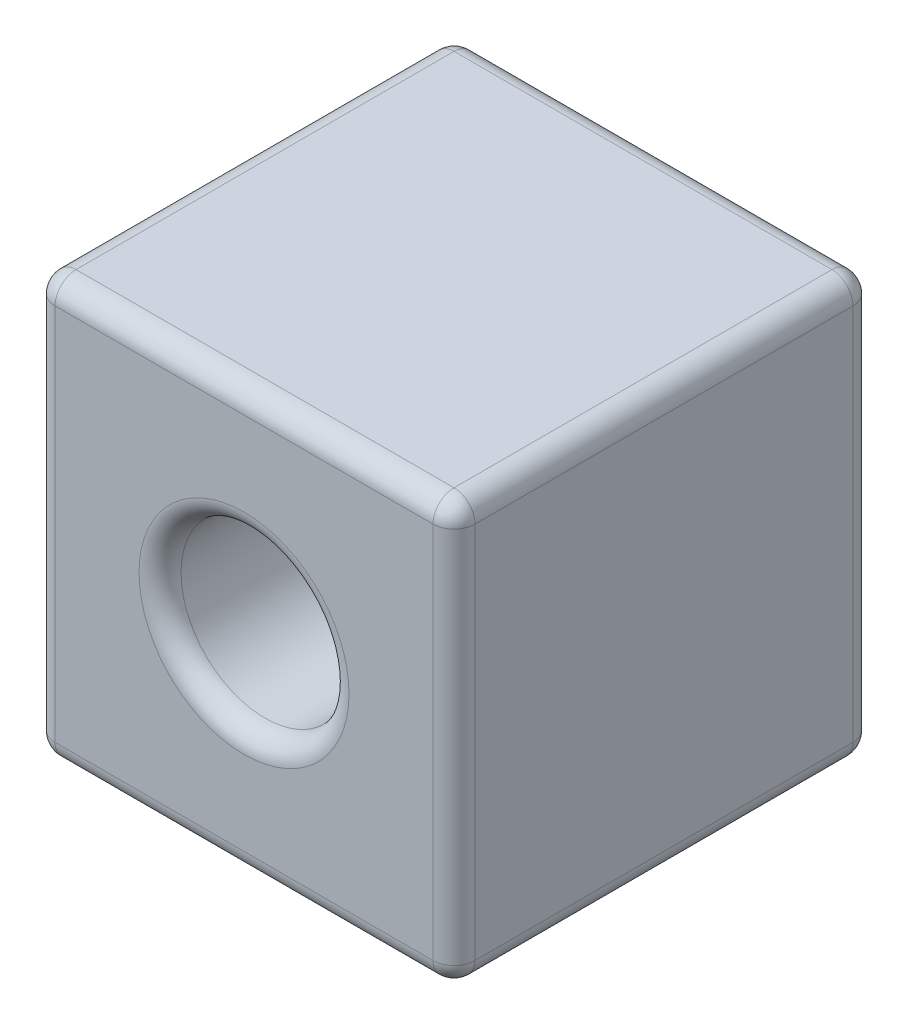
ISO-10303-21;
HEADER;
FILE_DESCRIPTION(('STEP AP214'),'2;1');
FILE_NAME('part.step','',(''),(''),'','','');
FILE_SCHEMA(('AUTOMOTIVE_DESIGN { 1 0 10303 214 1 1 1 1 }'));
ENDSEC;
DATA;
#1=APPLICATION_CONTEXT('core data for automotive mechanical design processes');
#2=APPLICATION_PROTOCOL_DEFINITION('international standard','automotive_design',2000,#1);
#3=PRODUCT_CONTEXT('',#1,'mechanical');
#4=PRODUCT('Part','Part','',(#3));
#5=PRODUCT_RELATED_PRODUCT_CATEGORY('part','',(#4));
#6=PRODUCT_DEFINITION_FORMATION('','',#4);
#7=PRODUCT_DEFINITION_CONTEXT('part definition',#1,'design');
#8=PRODUCT_DEFINITION('design','',#6,#7);
#9=PRODUCT_DEFINITION_SHAPE('','',#8);
#10=(LENGTH_UNIT() NAMED_UNIT(*) SI_UNIT(.MILLI.,.METRE.));
#11=(NAMED_UNIT(*) PLANE_ANGLE_UNIT() SI_UNIT($,.RADIAN.));
#12=(NAMED_UNIT(*) SI_UNIT($,.STERADIAN.) SOLID_ANGLE_UNIT());
#13=UNCERTAINTY_MEASURE_WITH_UNIT(LENGTH_MEASURE(1.E-05),#10,'distance_accuracy_value','');
#14=(GEOMETRIC_REPRESENTATION_CONTEXT(3) GLOBAL_UNCERTAINTY_ASSIGNED_CONTEXT((#13)) GLOBAL_UNIT_ASSIGNED_CONTEXT((#10,
#11,#12)) REPRESENTATION_CONTEXT('',''));
#15=CARTESIAN_POINT('',(0.,0.,0.));
#16=DIRECTION('',(0.,0.,1.));
#17=DIRECTION('',(1.,0.,0.));
#18=AXIS2_PLACEMENT_3D('',#15,#16,#17);
#19=CARTESIAN_POINT('',(0.,0.,100.));
#20=DIRECTION('',(0.,0.,1.));
#21=DIRECTION('',(1.,0.,0.));
#22=AXIS2_PLACEMENT_3D('',#19,#20,#21);
#23=PLANE('',#22);
#24=CARTESIAN_POINT('',(0.,0.,100.));
#25=DIRECTION('',(0.,0.,1.));
#26=DIRECTION('',(1.,0.,0.));
#27=AXIS2_PLACEMENT_3D('',#24,#25,#26);
#28=CIRCLE('',#27,25.);
#29=CARTESIAN_POINT('',(25.,0.,100.));
#30=VERTEX_POINT('',#29);
#31=EDGE_CURVE('E11',#30,#30,#28,.F.);
#32=ORIENTED_EDGE('',*,*,#31,.T.);
#33=EDGE_LOOP('',(#32));
#34=FACE_BOUND('',#33,.T.);
#35=DIRECTION('',(-1.,0.,0.));
#36=VECTOR('',#35,1.);
#37=CARTESIAN_POINT('',(-50.,45.,100.));
#38=LINE('',#37,#36);
#39=CARTESIAN_POINT('',(45.,45.,100.));
#40=VERTEX_POINT('',#39);
#41=CARTESIAN_POINT('',(-45.,45.,100.));
#42=VERTEX_POINT('',#41);
#43=EDGE_CURVE('E141',#40,#42,#38,.T.);
#44=ORIENTED_EDGE('',*,*,#43,.T.);
#45=DIRECTION('',(0.,-1.,0.));
#46=VECTOR('',#45,1.);
#47=CARTESIAN_POINT('',(-45.,-50.,100.));
#48=LINE('',#47,#46);
#49=CARTESIAN_POINT('',(-45.,-45.,100.));
#50=VERTEX_POINT('',#49);
#51=EDGE_CURVE('E200',#42,#50,#48,.T.);
#52=ORIENTED_EDGE('',*,*,#51,.T.);
#53=DIRECTION('',(1.,0.,0.));
#54=VECTOR('',#53,1.);
#55=CARTESIAN_POINT('',(50.,-45.,100.));
#56=LINE('',#55,#54);
#57=CARTESIAN_POINT('',(45.,-45.,100.));
#58=VERTEX_POINT('',#57);
#59=EDGE_CURVE('E195',#50,#58,#56,.T.);
#60=ORIENTED_EDGE('',*,*,#59,.T.);
#61=DIRECTION('',(0.,1.,0.));
#62=VECTOR('',#61,1.);
#63=CARTESIAN_POINT('',(45.,50.,100.));
#64=LINE('',#63,#62);
#65=EDGE_CURVE('E197',#58,#40,#64,.T.);
#66=ORIENTED_EDGE('',*,*,#65,.T.);
#67=EDGE_LOOP('',(#44,#52,#60,#66));
#68=FACE_BOUND('',#67,.T.);
#69=ADVANCED_FACE('F35',(#34,#68),#23,.T.);
#70=CARTESIAN_POINT('',(0.,0.,0.));
#71=DIRECTION('',(0.,0.,1.));
#72=DIRECTION('',(1.,0.,0.));
#73=AXIS2_PLACEMENT_3D('',#70,#71,#72);
#74=PLANE('',#73);
#75=CARTESIAN_POINT('',(0.,0.,0.));
#76=DIRECTION('',(0.,0.,1.));
#77=DIRECTION('',(1.,0.,0.));
#78=AXIS2_PLACEMENT_3D('',#75,#76,#77);
#79=CIRCLE('',#78,25.);
#80=CARTESIAN_POINT('',(25.,0.,0.));
#81=VERTEX_POINT('',#80);
#82=EDGE_CURVE('E209',#81,#81,#79,.T.);
#83=ORIENTED_EDGE('',*,*,#82,.T.);
#84=EDGE_LOOP('',(#83));
#85=FACE_BOUND('',#84,.T.);
#86=DIRECTION('',(0.,-1.,0.));
#87=VECTOR('',#86,1.);
#88=CARTESIAN_POINT('',(-45.,0.,0.));
#89=LINE('',#88,#87);
#90=CARTESIAN_POINT('',(-45.,-45.,0.));
#91=VERTEX_POINT('',#90);
#92=CARTESIAN_POINT('',(-45.,45.,0.));
#93=VERTEX_POINT('',#92);
#94=EDGE_CURVE('E172',#91,#93,#89,.F.);
#95=ORIENTED_EDGE('',*,*,#94,.T.);
#96=DIRECTION('',(-1.,0.,0.));
#97=VECTOR('',#96,1.);
#98=CARTESIAN_POINT('',(0.,45.,0.));
#99=LINE('',#98,#97);
#100=CARTESIAN_POINT('',(45.,45.,0.));
#101=VERTEX_POINT('',#100);
#102=EDGE_CURVE('E174',#93,#101,#99,.F.);
#103=ORIENTED_EDGE('',*,*,#102,.T.);
#104=DIRECTION('',(0.,1.,0.));
#105=VECTOR('',#104,1.);
#106=CARTESIAN_POINT('',(45.,0.,0.));
#107=LINE('',#106,#105);
#108=CARTESIAN_POINT('',(45.,-45.,0.));
#109=VERTEX_POINT('',#108);
#110=EDGE_CURVE('E168',#101,#109,#107,.F.);
#111=ORIENTED_EDGE('',*,*,#110,.T.);
#112=DIRECTION('',(1.,0.,0.));
#113=VECTOR('',#112,1.);
#114=CARTESIAN_POINT('',(0.,-45.,0.));
#115=LINE('',#114,#113);
#116=EDGE_CURVE('E170',#109,#91,#115,.F.);
#117=ORIENTED_EDGE('',*,*,#116,.T.);
#118=EDGE_LOOP('',(#95,#103,#111,#117));
#119=FACE_BOUND('',#118,.T.);
#120=ADVANCED_FACE('F275',(#85,#119),#74,.F.);
#121=CARTESIAN_POINT('',(50.,50.,100.));
#122=DIRECTION('',(-1.,0.,0.));
#123=DIRECTION('',(0.,-1.,0.));
#124=AXIS2_PLACEMENT_3D('',#121,#122,#123);
#125=PLANE('',#124);
#126=DIRECTION('',(0.,1.,0.));
#127=VECTOR('',#126,1.);
#128=CARTESIAN_POINT('',(50.,50.,5.));
#129=LINE('',#128,#127);
#130=CARTESIAN_POINT('',(50.,-45.,5.));
#131=VERTEX_POINT('',#130);
#132=CARTESIAN_POINT('',(50.,45.,5.));
#133=VERTEX_POINT('',#132);
#134=EDGE_CURVE('E50',#131,#133,#129,.T.);
#135=ORIENTED_EDGE('',*,*,#134,.T.);
#136=DIRECTION('',(0.,0.,-1.));
#137=VECTOR('',#136,1.);
#138=CARTESIAN_POINT('',(50.,45.,100.));
#139=LINE('',#138,#137);
#140=CARTESIAN_POINT('',(50.,45.,95.));
#141=VERTEX_POINT('',#140);
#142=EDGE_CURVE('E207',#133,#141,#139,.F.);
#143=ORIENTED_EDGE('',*,*,#142,.T.);
#144=DIRECTION('',(0.,1.,0.));
#145=VECTOR('',#144,1.);
#146=CARTESIAN_POINT('',(50.,-50.,95.));
#147=LINE('',#146,#145);
#148=CARTESIAN_POINT('',(50.,-45.,95.));
#149=VERTEX_POINT('',#148);
#150=EDGE_CURVE('E203',#141,#149,#147,.F.);
#151=ORIENTED_EDGE('',*,*,#150,.T.);
#152=DIRECTION('',(0.,0.,-1.));
#153=VECTOR('',#152,1.);
#154=CARTESIAN_POINT('',(50.,-45.,100.));
#155=LINE('',#154,#153);
#156=EDGE_CURVE('E55',#149,#131,#155,.T.);
#157=ORIENTED_EDGE('',*,*,#156,.T.);
#158=EDGE_LOOP('',(#135,#143,#151,#157));
#159=FACE_BOUND('',#158,.T.);
#160=ADVANCED_FACE('F278',(#159),#125,.F.);
#161=CARTESIAN_POINT('',(-50.,50.,100.));
#162=DIRECTION('',(0.,-1.,0.));
#163=DIRECTION('',(0.,0.,-1.));
#164=AXIS2_PLACEMENT_3D('',#161,#162,#163);
#165=PLANE('',#164);
#166=DIRECTION('',(0.,0.,-1.));
#167=VECTOR('',#166,1.);
#168=CARTESIAN_POINT('',(45.,50.,100.));
#169=LINE('',#168,#167);
#170=CARTESIAN_POINT('',(45.,50.,95.));
#171=VERTEX_POINT('',#170);
#172=CARTESIAN_POINT('',(45.,50.,5.));
#173=VERTEX_POINT('',#172);
#174=EDGE_CURVE('E128',#171,#173,#169,.T.);
#175=ORIENTED_EDGE('',*,*,#174,.T.);
#176=DIRECTION('',(-1.,0.,0.));
#177=VECTOR('',#176,1.);
#178=CARTESIAN_POINT('',(-50.,50.,5.));
#179=LINE('',#178,#177);
#180=CARTESIAN_POINT('',(-45.,50.,5.));
#181=VERTEX_POINT('',#180);
#182=EDGE_CURVE('E166',#173,#181,#179,.T.);
#183=ORIENTED_EDGE('',*,*,#182,.T.);
#184=DIRECTION('',(0.,0.,-1.));
#185=VECTOR('',#184,1.);
#186=CARTESIAN_POINT('',(-45.,50.,100.));
#187=LINE('',#186,#185);
#188=CARTESIAN_POINT('',(-45.,50.,95.));
#189=VERTEX_POINT('',#188);
#190=EDGE_CURVE('E131',#181,#189,#187,.F.);
#191=ORIENTED_EDGE('',*,*,#190,.T.);
#192=DIRECTION('',(-1.,0.,0.));
#193=VECTOR('',#192,1.);
#194=CARTESIAN_POINT('',(50.,50.,95.));
#195=LINE('',#194,#193);
#196=EDGE_CURVE('E123',#189,#171,#195,.F.);
#197=ORIENTED_EDGE('',*,*,#196,.T.);
#198=EDGE_LOOP('',(#175,#183,#191,#197));
#199=FACE_BOUND('',#198,.T.);
#200=ADVANCED_FACE('F125',(#199),#165,.F.);
#201=CARTESIAN_POINT('',(-50.,50.,100.));
#202=DIRECTION('',(1.,0.,0.));
#203=DIRECTION('',(0.,1.,0.));
#204=AXIS2_PLACEMENT_3D('',#201,#202,#203);
#205=PLANE('',#204);
#206=DIRECTION('',(0.,-1.,0.));
#207=VECTOR('',#206,1.);
#208=CARTESIAN_POINT('',(-50.,50.,95.));
#209=LINE('',#208,#207);
#210=CARTESIAN_POINT('',(-50.,-45.,95.));
#211=VERTEX_POINT('',#210);
#212=CARTESIAN_POINT('',(-50.,45.,95.));
#213=VERTEX_POINT('',#212);
#214=EDGE_CURVE('E177',#211,#213,#209,.F.);
#215=ORIENTED_EDGE('',*,*,#214,.T.);
#216=DIRECTION('',(0.,0.,-1.));
#217=VECTOR('',#216,1.);
#218=CARTESIAN_POINT('',(-50.,45.,100.));
#219=LINE('',#218,#217);
#220=CARTESIAN_POINT('',(-50.,45.,5.));
#221=VERTEX_POINT('',#220);
#222=EDGE_CURVE('E183',#213,#221,#219,.T.);
#223=ORIENTED_EDGE('',*,*,#222,.T.);
#224=DIRECTION('',(0.,-1.,0.));
#225=VECTOR('',#224,1.);
#226=CARTESIAN_POINT('',(-50.,50.,5.));
#227=LINE('',#226,#225);
#228=CARTESIAN_POINT('',(-50.,-45.,5.));
#229=VERTEX_POINT('',#228);
#230=EDGE_CURVE('E181',#221,#229,#227,.T.);
#231=ORIENTED_EDGE('',*,*,#230,.T.);
#232=DIRECTION('',(0.,0.,-1.));
#233=VECTOR('',#232,1.);
#234=CARTESIAN_POINT('',(-50.,-45.,100.));
#235=LINE('',#234,#233);
#236=EDGE_CURVE('E179',#229,#211,#235,.F.);
#237=ORIENTED_EDGE('',*,*,#236,.T.);
#238=EDGE_LOOP('',(#215,#223,#231,#237));
#239=FACE_BOUND('',#238,.T.);
#240=ADVANCED_FACE('F338',(#239),#205,.F.);
#241=CARTESIAN_POINT('',(-50.,-50.,100.));
#242=DIRECTION('',(0.,1.,0.));
#243=DIRECTION('',(0.,0.,1.));
#244=AXIS2_PLACEMENT_3D('',#241,#242,#243);
#245=PLANE('',#244);
#246=DIRECTION('',(0.,0.,-1.));
#247=VECTOR('',#246,1.);
#248=CARTESIAN_POINT('',(-45.,-50.,100.));
#249=LINE('',#248,#247);
#250=CARTESIAN_POINT('',(-45.,-50.,95.));
#251=VERTEX_POINT('',#250);
#252=CARTESIAN_POINT('',(-45.,-50.,5.));
#253=VERTEX_POINT('',#252);
#254=EDGE_CURVE('E190',#251,#253,#249,.T.);
#255=ORIENTED_EDGE('',*,*,#254,.T.);
#256=DIRECTION('',(1.,0.,0.));
#257=VECTOR('',#256,1.);
#258=CARTESIAN_POINT('',(-50.,-50.,5.));
#259=LINE('',#258,#257);
#260=CARTESIAN_POINT('',(45.,-50.,5.));
#261=VERTEX_POINT('',#260);
#262=EDGE_CURVE('E192',#253,#261,#259,.T.);
#263=ORIENTED_EDGE('',*,*,#262,.T.);
#264=DIRECTION('',(0.,0.,-1.));
#265=VECTOR('',#264,1.);
#266=CARTESIAN_POINT('',(45.,-50.,100.));
#267=LINE('',#266,#265);
#268=CARTESIAN_POINT('',(45.,-50.,95.));
#269=VERTEX_POINT('',#268);
#270=EDGE_CURVE('E188',#261,#269,#267,.F.);
#271=ORIENTED_EDGE('',*,*,#270,.T.);
#272=DIRECTION('',(1.,0.,0.));
#273=VECTOR('',#272,1.);
#274=CARTESIAN_POINT('',(-50.,-50.,95.));
#275=LINE('',#274,#273);
#276=EDGE_CURVE('E186',#269,#251,#275,.F.);
#277=ORIENTED_EDGE('',*,*,#276,.T.);
#278=EDGE_LOOP('',(#255,#263,#271,#277));
#279=FACE_BOUND('',#278,.T.);
#280=ADVANCED_FACE('F335',(#279),#245,.F.);
#281=CARTESIAN_POINT('',(0.,0.,100.));
#282=DIRECTION('',(0.,0.,-1.));
#283=DIRECTION('',(-1.,0.,0.));
#284=AXIS2_PLACEMENT_3D('',#281,#282,#283);
#285=CYLINDRICAL_SURFACE('',#284,20.);
#286=CARTESIAN_POINT('',(0.,0.,5.));
#287=DIRECTION('',(0.,0.,1.));
#288=DIRECTION('',(1.,0.,0.));
#289=AXIS2_PLACEMENT_3D('',#286,#287,#288);
#290=CIRCLE('',#289,20.);
#291=CARTESIAN_POINT('',(20.,0.,5.));
#292=VERTEX_POINT('',#291);
#293=EDGE_CURVE('E43',#292,#292,#290,.F.);
#294=ORIENTED_EDGE('',*,*,#293,.T.);
#295=EDGE_LOOP('',(#294));
#296=FACE_BOUND('',#295,.T.);
#297=CARTESIAN_POINT('',(0.,0.,95.));
#298=DIRECTION('',(0.,0.,1.));
#299=DIRECTION('',(1.,0.,0.));
#300=AXIS2_PLACEMENT_3D('',#297,#298,#299);
#301=CIRCLE('',#300,20.);
#302=CARTESIAN_POINT('',(20.,0.,95.));
#303=VERTEX_POINT('',#302);
#304=EDGE_CURVE('E261',#303,#303,#301,.T.);
#305=ORIENTED_EDGE('',*,*,#304,.T.);
#306=EDGE_LOOP('',(#305));
#307=FACE_BOUND('',#306,.T.);
#308=ADVANCED_FACE('F266',(#296,#307),#285,.F.);
#309=CARTESIAN_POINT('',(0.,-45.,95.));
#310=DIRECTION('',(-1.,0.,0.));
#311=DIRECTION('',(0.,0.,1.));
#312=AXIS2_PLACEMENT_3D('',#309,#310,#311);
#313=CYLINDRICAL_SURFACE('',#312,5.);
#314=CARTESIAN_POINT('',(45.,-45.,95.));
#315=DIRECTION('',(1.,0.,0.));
#316=DIRECTION('',(0.,0.,-1.));
#317=AXIS2_PLACEMENT_3D('',#314,#315,#316);
#318=CIRCLE('',#317,5.);
#319=EDGE_CURVE('E159',#58,#269,#318,.T.);
#320=ORIENTED_EDGE('',*,*,#319,.F.);
#321=ORIENTED_EDGE('',*,*,#59,.F.);
#322=CARTESIAN_POINT('',(-45.,-45.,95.));
#323=DIRECTION('',(-1.,0.,0.));
#324=DIRECTION('',(0.,0.,1.));
#325=AXIS2_PLACEMENT_3D('',#322,#323,#324);
#326=CIRCLE('',#325,5.);
#327=EDGE_CURVE('E162',#251,#50,#326,.T.);
#328=ORIENTED_EDGE('',*,*,#327,.F.);
#329=ORIENTED_EDGE('',*,*,#276,.F.);
#330=EDGE_LOOP('',(#320,#321,#328,#329));
#331=FACE_BOUND('',#330,.T.);
#332=ADVANCED_FACE('F501',(#331),#313,.T.);
#333=CARTESIAN_POINT('',(45.,-45.,95.));
#334=DIRECTION('',(0.,0.,1.));
#335=DIRECTION('',(1.,0.,0.));
#336=AXIS2_PLACEMENT_3D('',#333,#334,#335);
#337=SPHERICAL_SURFACE('',#336,5.);
#338=CARTESIAN_POINT('',(45.,-45.,95.));
#339=DIRECTION('',(0.,-1.,0.));
#340=DIRECTION('',(0.,0.,-1.));
#341=AXIS2_PLACEMENT_3D('',#338,#339,#340);
#342=CIRCLE('',#341,5.);
#343=EDGE_CURVE('E251',#58,#149,#342,.F.);
#344=ORIENTED_EDGE('',*,*,#343,.F.);
#345=ORIENTED_EDGE('',*,*,#319,.T.);
#346=CARTESIAN_POINT('',(45.,-45.,95.));
#347=DIRECTION('',(0.,0.,1.));
#348=DIRECTION('',(1.,0.,0.));
#349=AXIS2_PLACEMENT_3D('',#346,#347,#348);
#350=CIRCLE('',#349,5.);
#351=EDGE_CURVE('E254',#149,#269,#350,.F.);
#352=ORIENTED_EDGE('',*,*,#351,.F.);
#353=EDGE_LOOP('',(#344,#345,#352));
#354=FACE_BOUND('',#353,.T.);
#355=ADVANCED_FACE('F492',(#354),#337,.T.);
#356=CARTESIAN_POINT('',(-45.,-45.,95.));
#357=DIRECTION('',(0.,0.,1.));
#358=DIRECTION('',(1.,0.,0.));
#359=AXIS2_PLACEMENT_3D('',#356,#357,#358);
#360=SPHERICAL_SURFACE('',#359,5.);
#361=CARTESIAN_POINT('',(-45.,-45.,95.));
#362=DIRECTION('',(0.,0.,1.));
#363=DIRECTION('',(1.,0.,0.));
#364=AXIS2_PLACEMENT_3D('',#361,#362,#363);
#365=CIRCLE('',#364,5.);
#366=EDGE_CURVE('E246',#251,#211,#365,.F.);
#367=ORIENTED_EDGE('',*,*,#366,.F.);
#368=ORIENTED_EDGE('',*,*,#327,.T.);
#369=CARTESIAN_POINT('',(-45.,-45.,95.));
#370=DIRECTION('',(0.,-1.,0.));
#371=DIRECTION('',(0.,0.,-1.));
#372=AXIS2_PLACEMENT_3D('',#369,#370,#371);
#373=CIRCLE('',#372,5.);
#374=EDGE_CURVE('E249',#211,#50,#373,.F.);
#375=ORIENTED_EDGE('',*,*,#374,.F.);
#376=EDGE_LOOP('',(#367,#368,#375));
#377=FACE_BOUND('',#376,.T.);
#378=ADVANCED_FACE('F483',(#377),#360,.T.);
#379=CARTESIAN_POINT('',(45.,-45.,100.));
#380=DIRECTION('',(0.,0.,-1.));
#381=DIRECTION('',(-1.,0.,0.));
#382=AXIS2_PLACEMENT_3D('',#379,#380,#381);
#383=CYLINDRICAL_SURFACE('',#382,5.);
#384=ORIENTED_EDGE('',*,*,#351,.T.);
#385=ORIENTED_EDGE('',*,*,#270,.F.);
#386=CARTESIAN_POINT('',(45.,-45.,5.));
#387=DIRECTION('',(0.,0.,-1.));
#388=DIRECTION('',(-1.,0.,0.));
#389=AXIS2_PLACEMENT_3D('',#386,#387,#388);
#390=CIRCLE('',#389,5.);
#391=EDGE_CURVE('E241',#131,#261,#390,.T.);
#392=ORIENTED_EDGE('',*,*,#391,.F.);
#393=ORIENTED_EDGE('',*,*,#156,.F.);
#394=EDGE_LOOP('',(#384,#385,#392,#393));
#395=FACE_BOUND('',#394,.T.);
#396=ADVANCED_FACE('F475',(#395),#383,.T.);
#397=CARTESIAN_POINT('',(45.,0.,95.));
#398=DIRECTION('',(0.,-1.,0.));
#399=DIRECTION('',(1.,0.,0.));
#400=AXIS2_PLACEMENT_3D('',#397,#398,#399);
#401=CYLINDRICAL_SURFACE('',#400,5.);
#402=ORIENTED_EDGE('',*,*,#343,.T.);
#403=ORIENTED_EDGE('',*,*,#150,.F.);
#404=CARTESIAN_POINT('',(45.,45.,95.));
#405=DIRECTION('',(0.,1.,0.));
#406=DIRECTION('',(0.,0.,1.));
#407=AXIS2_PLACEMENT_3D('',#404,#405,#406);
#408=CIRCLE('',#407,5.);
#409=EDGE_CURVE('E145',#40,#141,#408,.T.);
#410=ORIENTED_EDGE('',*,*,#409,.F.);
#411=ORIENTED_EDGE('',*,*,#65,.F.);
#412=EDGE_LOOP('',(#402,#403,#410,#411));
#413=FACE_BOUND('',#412,.T.);
#414=ADVANCED_FACE('F311',(#413),#401,.T.);
#415=CARTESIAN_POINT('',(0.,45.,95.));
#416=DIRECTION('',(1.,0.,0.));
#417=DIRECTION('',(0.,0.,-1.));
#418=AXIS2_PLACEMENT_3D('',#415,#416,#417);
#419=CYLINDRICAL_SURFACE('',#418,5.);
#420=CARTESIAN_POINT('',(-45.,45.,95.));
#421=DIRECTION('',(-1.,0.,0.));
#422=DIRECTION('',(0.,0.,1.));
#423=AXIS2_PLACEMENT_3D('',#420,#421,#422);
#424=CIRCLE('',#423,5.);
#425=EDGE_CURVE('E146',#42,#189,#424,.T.);
#426=ORIENTED_EDGE('',*,*,#425,.F.);
#427=ORIENTED_EDGE('',*,*,#43,.F.);
#428=CARTESIAN_POINT('',(45.,45.,95.));
#429=DIRECTION('',(1.,0.,0.));
#430=DIRECTION('',(0.,0.,-1.));
#431=AXIS2_PLACEMENT_3D('',#428,#429,#430);
#432=CIRCLE('',#431,5.);
#433=EDGE_CURVE('E138',#171,#40,#432,.T.);
#434=ORIENTED_EDGE('',*,*,#433,.F.);
#435=ORIENTED_EDGE('',*,*,#196,.F.);
#436=EDGE_LOOP('',(#426,#427,#434,#435));
#437=FACE_BOUND('',#436,.T.);
#438=ADVANCED_FACE('F140',(#437),#419,.T.);
#439=CARTESIAN_POINT('',(-45.,0.,95.));
#440=DIRECTION('',(0.,1.,0.));
#441=DIRECTION('',(-1.,0.,0.));
#442=AXIS2_PLACEMENT_3D('',#439,#440,#441);
#443=CYLINDRICAL_SURFACE('',#442,5.);
#444=ORIENTED_EDGE('',*,*,#374,.T.);
#445=ORIENTED_EDGE('',*,*,#51,.F.);
#446=CARTESIAN_POINT('',(-45.,45.,95.));
#447=DIRECTION('',(0.,1.,0.));
#448=DIRECTION('',(0.,0.,1.));
#449=AXIS2_PLACEMENT_3D('',#446,#447,#448);
#450=CIRCLE('',#449,5.);
#451=EDGE_CURVE('E236',#213,#42,#450,.T.);
#452=ORIENTED_EDGE('',*,*,#451,.F.);
#453=ORIENTED_EDGE('',*,*,#214,.F.);
#454=EDGE_LOOP('',(#444,#445,#452,#453));
#455=FACE_BOUND('',#454,.T.);
#456=ADVANCED_FACE('F304',(#455),#443,.T.);
#457=CARTESIAN_POINT('',(-45.,-45.,100.));
#458=DIRECTION('',(0.,0.,-1.));
#459=DIRECTION('',(-1.,0.,0.));
#460=AXIS2_PLACEMENT_3D('',#457,#458,#459);
#461=CYLINDRICAL_SURFACE('',#460,5.);
#462=ORIENTED_EDGE('',*,*,#366,.T.);
#463=ORIENTED_EDGE('',*,*,#236,.F.);
#464=CARTESIAN_POINT('',(-45.,-45.,5.));
#465=DIRECTION('',(0.,0.,-1.));
#466=DIRECTION('',(-1.,0.,0.));
#467=AXIS2_PLACEMENT_3D('',#464,#465,#466);
#468=CIRCLE('',#467,5.);
#469=EDGE_CURVE('E233',#253,#229,#468,.T.);
#470=ORIENTED_EDGE('',*,*,#469,.F.);
#471=ORIENTED_EDGE('',*,*,#254,.F.);
#472=EDGE_LOOP('',(#462,#463,#470,#471));
#473=FACE_BOUND('',#472,.T.);
#474=ADVANCED_FACE('F444',(#473),#461,.T.);
#475=CARTESIAN_POINT('',(-50.,-45.,5.));
#476=DIRECTION('',(1.,0.,0.));
#477=DIRECTION('',(0.,0.,-1.));
#478=AXIS2_PLACEMENT_3D('',#475,#476,#477);
#479=CYLINDRICAL_SURFACE('',#478,5.);
#480=CARTESIAN_POINT('',(45.,-45.,5.));
#481=DIRECTION('',(1.,0.,0.));
#482=DIRECTION('',(0.,0.,-1.));
#483=AXIS2_PLACEMENT_3D('',#480,#481,#482);
#484=CIRCLE('',#483,5.);
#485=EDGE_CURVE('E243',#261,#109,#484,.T.);
#486=ORIENTED_EDGE('',*,*,#485,.F.);
#487=ORIENTED_EDGE('',*,*,#262,.F.);
#488=CARTESIAN_POINT('',(-45.,-45.,5.));
#489=DIRECTION('',(-1.,0.,0.));
#490=DIRECTION('',(0.,0.,1.));
#491=AXIS2_PLACEMENT_3D('',#488,#489,#490);
#492=CIRCLE('',#491,5.);
#493=EDGE_CURVE('E230',#91,#253,#492,.T.);
#494=ORIENTED_EDGE('',*,*,#493,.F.);
#495=ORIENTED_EDGE('',*,*,#116,.F.);
#496=EDGE_LOOP('',(#486,#487,#494,#495));
#497=FACE_BOUND('',#496,.T.);
#498=ADVANCED_FACE('F435',(#497),#479,.T.);
#499=CARTESIAN_POINT('',(45.,-45.,5.));
#500=DIRECTION('',(0.,0.,1.));
#501=DIRECTION('',(1.,0.,0.));
#502=AXIS2_PLACEMENT_3D('',#499,#500,#501);
#503=SPHERICAL_SURFACE('',#502,5.);
#504=ORIENTED_EDGE('',*,*,#391,.T.);
#505=ORIENTED_EDGE('',*,*,#485,.T.);
#506=CARTESIAN_POINT('',(45.,-45.,5.));
#507=DIRECTION('',(0.,-1.,0.));
#508=DIRECTION('',(1.,0.,0.));
#509=AXIS2_PLACEMENT_3D('',#506,#507,#508);
#510=CIRCLE('',#509,5.);
#511=EDGE_CURVE('E152',#131,#109,#510,.F.);
#512=ORIENTED_EDGE('',*,*,#511,.F.);
#513=EDGE_LOOP('',(#504,#505,#512));
#514=FACE_BOUND('',#513,.T.);
#515=ADVANCED_FACE('F427',(#514),#503,.T.);
#516=CARTESIAN_POINT('',(45.,45.,95.));
#517=DIRECTION('',(0.,0.,1.));
#518=DIRECTION('',(1.,0.,0.));
#519=AXIS2_PLACEMENT_3D('',#516,#517,#518);
#520=SPHERICAL_SURFACE('',#519,5.);
#521=ORIENTED_EDGE('',*,*,#433,.T.);
#522=ORIENTED_EDGE('',*,*,#409,.T.);
#523=CARTESIAN_POINT('',(45.,45.,95.));
#524=DIRECTION('',(0.,0.,1.));
#525=DIRECTION('',(1.,0.,0.));
#526=AXIS2_PLACEMENT_3D('',#523,#524,#525);
#527=CIRCLE('',#526,5.);
#528=EDGE_CURVE('E148',#171,#141,#527,.F.);
#529=ORIENTED_EDGE('',*,*,#528,.F.);
#530=EDGE_LOOP('',(#521,#522,#529));
#531=FACE_BOUND('',#530,.T.);
#532=ADVANCED_FACE('F149',(#531),#520,.T.);
#533=CARTESIAN_POINT('',(-45.,45.,95.));
#534=DIRECTION('',(0.,0.,1.));
#535=DIRECTION('',(1.,0.,0.));
#536=AXIS2_PLACEMENT_3D('',#533,#534,#535);
#537=SPHERICAL_SURFACE('',#536,5.);
#538=ORIENTED_EDGE('',*,*,#451,.T.);
#539=ORIENTED_EDGE('',*,*,#425,.T.);
#540=CARTESIAN_POINT('',(-45.,45.,95.));
#541=DIRECTION('',(0.,0.,1.));
#542=DIRECTION('',(1.,0.,0.));
#543=AXIS2_PLACEMENT_3D('',#540,#541,#542);
#544=CIRCLE('',#543,5.);
#545=EDGE_CURVE('E153',#213,#189,#544,.F.);
#546=ORIENTED_EDGE('',*,*,#545,.F.);
#547=EDGE_LOOP('',(#538,#539,#546));
#548=FACE_BOUND('',#547,.T.);
#549=ADVANCED_FACE('F299',(#548),#537,.T.);
#550=CARTESIAN_POINT('',(-45.,-45.,5.));
#551=DIRECTION('',(0.,0.,1.));
#552=DIRECTION('',(1.,0.,0.));
#553=AXIS2_PLACEMENT_3D('',#550,#551,#552);
#554=SPHERICAL_SURFACE('',#553,5.);
#555=ORIENTED_EDGE('',*,*,#493,.T.);
#556=ORIENTED_EDGE('',*,*,#469,.T.);
#557=CARTESIAN_POINT('',(-45.,-45.,5.));
#558=DIRECTION('',(0.,-1.,0.));
#559=DIRECTION('',(0.,0.,-1.));
#560=AXIS2_PLACEMENT_3D('',#557,#558,#559);
#561=CIRCLE('',#560,5.);
#562=EDGE_CURVE('E223',#91,#229,#561,.F.);
#563=ORIENTED_EDGE('',*,*,#562,.F.);
#564=EDGE_LOOP('',(#555,#556,#563));
#565=FACE_BOUND('',#564,.T.);
#566=ADVANCED_FACE('F404',(#565),#554,.T.);
#567=CARTESIAN_POINT('',(45.,50.,5.));
#568=DIRECTION('',(0.,1.,0.));
#569=DIRECTION('',(-1.,0.,0.));
#570=AXIS2_PLACEMENT_3D('',#567,#568,#569);
#571=CYLINDRICAL_SURFACE('',#570,5.);
#572=ORIENTED_EDGE('',*,*,#511,.T.);
#573=ORIENTED_EDGE('',*,*,#110,.F.);
#574=CARTESIAN_POINT('',(45.,45.,5.));
#575=DIRECTION('',(0.,1.,0.));
#576=DIRECTION('',(0.,0.,1.));
#577=AXIS2_PLACEMENT_3D('',#574,#575,#576);
#578=CIRCLE('',#577,5.);
#579=EDGE_CURVE('E220',#133,#101,#578,.T.);
#580=ORIENTED_EDGE('',*,*,#579,.F.);
#581=ORIENTED_EDGE('',*,*,#134,.F.);
#582=EDGE_LOOP('',(#572,#573,#580,#581));
#583=FACE_BOUND('',#582,.T.);
#584=ADVANCED_FACE('F317',(#583),#571,.T.);
#585=CARTESIAN_POINT('',(45.,45.,100.));
#586=DIRECTION('',(0.,0.,-1.));
#587=DIRECTION('',(-1.,0.,0.));
#588=AXIS2_PLACEMENT_3D('',#585,#586,#587);
#589=CYLINDRICAL_SURFACE('',#588,5.);
#590=ORIENTED_EDGE('',*,*,#528,.T.);
#591=ORIENTED_EDGE('',*,*,#142,.F.);
#592=CARTESIAN_POINT('',(45.,45.,5.));
#593=DIRECTION('',(0.,0.,-1.));
#594=DIRECTION('',(-1.,0.,0.));
#595=AXIS2_PLACEMENT_3D('',#592,#593,#594);
#596=CIRCLE('',#595,5.);
#597=EDGE_CURVE('E157',#173,#133,#596,.T.);
#598=ORIENTED_EDGE('',*,*,#597,.F.);
#599=ORIENTED_EDGE('',*,*,#174,.F.);
#600=EDGE_LOOP('',(#590,#591,#598,#599));
#601=FACE_BOUND('',#600,.T.);
#602=ADVANCED_FACE('F155',(#601),#589,.T.);
#603=CARTESIAN_POINT('',(-45.,45.,100.));
#604=DIRECTION('',(0.,0.,-1.));
#605=DIRECTION('',(-1.,0.,0.));
#606=AXIS2_PLACEMENT_3D('',#603,#604,#605);
#607=CYLINDRICAL_SURFACE('',#606,5.);
#608=ORIENTED_EDGE('',*,*,#545,.T.);
#609=ORIENTED_EDGE('',*,*,#190,.F.);
#610=CARTESIAN_POINT('',(-45.,45.,5.));
#611=DIRECTION('',(0.,0.,-1.));
#612=DIRECTION('',(-1.,0.,0.));
#613=AXIS2_PLACEMENT_3D('',#610,#611,#612);
#614=CIRCLE('',#613,5.);
#615=EDGE_CURVE('E216',#221,#181,#614,.T.);
#616=ORIENTED_EDGE('',*,*,#615,.F.);
#617=ORIENTED_EDGE('',*,*,#222,.F.);
#618=EDGE_LOOP('',(#608,#609,#616,#617));
#619=FACE_BOUND('',#618,.T.);
#620=ADVANCED_FACE('F296',(#619),#607,.T.);
#621=CARTESIAN_POINT('',(-45.,50.,5.));
#622=DIRECTION('',(0.,-1.,0.));
#623=DIRECTION('',(1.,0.,0.));
#624=AXIS2_PLACEMENT_3D('',#621,#622,#623);
#625=CYLINDRICAL_SURFACE('',#624,5.);
#626=ORIENTED_EDGE('',*,*,#562,.T.);
#627=ORIENTED_EDGE('',*,*,#230,.F.);
#628=CARTESIAN_POINT('',(-45.,45.,5.));
#629=DIRECTION('',(0.,1.,0.));
#630=DIRECTION('',(0.,0.,1.));
#631=AXIS2_PLACEMENT_3D('',#628,#629,#630);
#632=CIRCLE('',#631,5.);
#633=EDGE_CURVE('E214',#93,#221,#632,.T.);
#634=ORIENTED_EDGE('',*,*,#633,.F.);
#635=ORIENTED_EDGE('',*,*,#94,.F.);
#636=EDGE_LOOP('',(#626,#627,#634,#635));
#637=FACE_BOUND('',#636,.T.);
#638=ADVANCED_FACE('F287',(#637),#625,.T.);
#639=CARTESIAN_POINT('',(45.,45.,5.));
#640=DIRECTION('',(0.,0.,1.));
#641=DIRECTION('',(1.,0.,0.));
#642=AXIS2_PLACEMENT_3D('',#639,#640,#641);
#643=SPHERICAL_SURFACE('',#642,5.);
#644=ORIENTED_EDGE('',*,*,#597,.T.);
#645=ORIENTED_EDGE('',*,*,#579,.T.);
#646=CARTESIAN_POINT('',(45.,45.,5.));
#647=DIRECTION('',(1.,0.,0.));
#648=DIRECTION('',(0.,1.,0.));
#649=AXIS2_PLACEMENT_3D('',#646,#647,#648);
#650=CIRCLE('',#649,5.);
#651=EDGE_CURVE('E212',#173,#101,#650,.F.);
#652=ORIENTED_EDGE('',*,*,#651,.F.);
#653=EDGE_LOOP('',(#644,#645,#652));
#654=FACE_BOUND('',#653,.T.);
#655=ADVANCED_FACE('F319',(#654),#643,.T.);
#656=CARTESIAN_POINT('',(-45.,45.,5.));
#657=DIRECTION('',(0.,0.,1.));
#658=DIRECTION('',(1.,0.,0.));
#659=AXIS2_PLACEMENT_3D('',#656,#657,#658);
#660=SPHERICAL_SURFACE('',#659,5.);
#661=ORIENTED_EDGE('',*,*,#633,.T.);
#662=ORIENTED_EDGE('',*,*,#615,.T.);
#663=CARTESIAN_POINT('',(-45.,45.,5.));
#664=DIRECTION('',(-1.,0.,0.));
#665=DIRECTION('',(0.,0.,1.));
#666=AXIS2_PLACEMENT_3D('',#663,#664,#665);
#667=CIRCLE('',#666,5.);
#668=EDGE_CURVE('E210',#93,#181,#667,.F.);
#669=ORIENTED_EDGE('',*,*,#668,.F.);
#670=EDGE_LOOP('',(#661,#662,#669));
#671=FACE_BOUND('',#670,.T.);
#672=ADVANCED_FACE('F293',(#671),#660,.T.);
#673=CARTESIAN_POINT('',(-50.,45.,5.));
#674=DIRECTION('',(-1.,0.,0.));
#675=DIRECTION('',(0.,0.,1.));
#676=AXIS2_PLACEMENT_3D('',#673,#674,#675);
#677=CYLINDRICAL_SURFACE('',#676,5.);
#678=ORIENTED_EDGE('',*,*,#651,.T.);
#679=ORIENTED_EDGE('',*,*,#102,.F.);
#680=ORIENTED_EDGE('',*,*,#668,.T.);
#681=ORIENTED_EDGE('',*,*,#182,.F.);
#682=EDGE_LOOP('',(#678,#679,#680,#681));
#683=FACE_BOUND('',#682,.T.);
#684=ADVANCED_FACE('F272',(#683),#677,.T.);
#685=CARTESIAN_POINT('',(0.,0.,5.));
#686=DIRECTION('',(0.,0.,1.));
#687=DIRECTION('',(1.,0.,0.));
#688=AXIS2_PLACEMENT_3D('',#685,#686,#687);
#689=TOROIDAL_SURFACE('',#688,25.,5.);
#690=ORIENTED_EDGE('',*,*,#293,.F.);
#691=EDGE_LOOP('',(#690));
#692=FACE_BOUND('',#691,.T.);
#693=ORIENTED_EDGE('',*,*,#82,.F.);
#694=EDGE_LOOP('',(#693));
#695=FACE_BOUND('',#694,.T.);
#696=ADVANCED_FACE('F269',(#692,#695),#689,.T.);
#697=CARTESIAN_POINT('',(0.,0.,95.));
#698=DIRECTION('',(0.,0.,1.));
#699=DIRECTION('',(1.,0.,0.));
#700=AXIS2_PLACEMENT_3D('',#697,#698,#699);
#701=TOROIDAL_SURFACE('',#700,25.,5.);
#702=ORIENTED_EDGE('',*,*,#31,.F.);
#703=EDGE_LOOP('',(#702));
#704=FACE_BOUND('',#703,.T.);
#705=ORIENTED_EDGE('',*,*,#304,.F.);
#706=EDGE_LOOP('',(#705));
#707=FACE_BOUND('',#706,.T.);
#708=ADVANCED_FACE('F37',(#704,#707),#701,.T.);
#709=CLOSED_SHELL('',(#69,#120,#160,#200,#240,#280,#308,#332,#355,#378,#396,#414,#438,#456,#474,
#498,#515,#532,#549,#566,#584,#602,#620,#638,#655,#672,#684,#696,#708));
#710=MANIFOLD_SOLID_BREP('B2',#709);
#711=ADVANCED_BREP_SHAPE_REPRESENTATION('',(#18,#710),#14);
#712=SHAPE_DEFINITION_REPRESENTATION(#9,#711);
ENDSEC;
END-ISO-10303-21;
